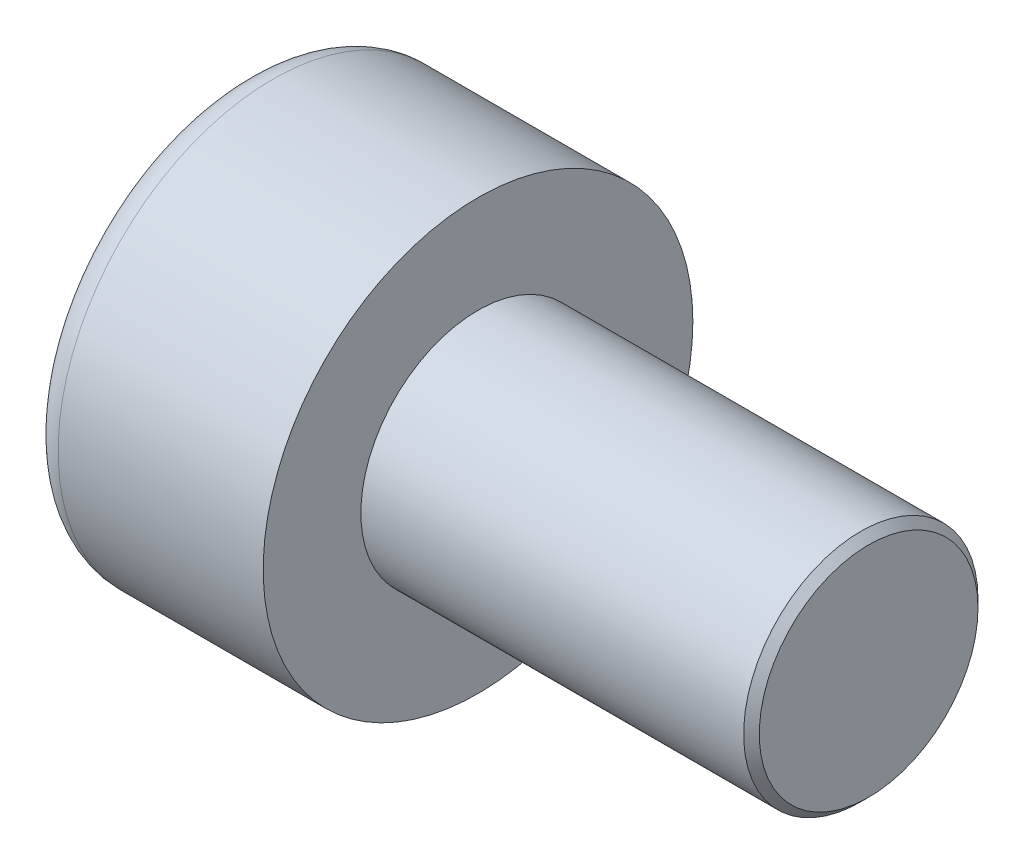
ISO-10303-21;
HEADER;
FILE_DESCRIPTION(('STEP AP214'),'2;1');
FILE_NAME('part.step','',(''),(''),'','','');
FILE_SCHEMA(('AUTOMOTIVE_DESIGN { 1 0 10303 214 1 1 1 1 }'));
ENDSEC;
DATA;
#1=APPLICATION_CONTEXT('core data for automotive mechanical design processes');
#2=APPLICATION_PROTOCOL_DEFINITION('international standard','automotive_design',2000,#1);
#3=PRODUCT_CONTEXT('',#1,'mechanical');
#4=PRODUCT('Part','Part','',(#3));
#5=PRODUCT_RELATED_PRODUCT_CATEGORY('part','',(#4));
#6=PRODUCT_DEFINITION_FORMATION('','',#4);
#7=PRODUCT_DEFINITION_CONTEXT('part definition',#1,'design');
#8=PRODUCT_DEFINITION('design','',#6,#7);
#9=PRODUCT_DEFINITION_SHAPE('','',#8);
#10=(LENGTH_UNIT() NAMED_UNIT(*) SI_UNIT(.MILLI.,.METRE.));
#11=(NAMED_UNIT(*) PLANE_ANGLE_UNIT() SI_UNIT($,.RADIAN.));
#12=(NAMED_UNIT(*) SI_UNIT($,.STERADIAN.) SOLID_ANGLE_UNIT());
#13=UNCERTAINTY_MEASURE_WITH_UNIT(LENGTH_MEASURE(1.E-05),#10,'distance_accuracy_value','');
#14=(GEOMETRIC_REPRESENTATION_CONTEXT(3) GLOBAL_UNCERTAINTY_ASSIGNED_CONTEXT((#13)) GLOBAL_UNIT_ASSIGNED_CONTEXT((#10,
#11,#12)) REPRESENTATION_CONTEXT('',''));
#15=CARTESIAN_POINT('',(0.,0.,0.));
#16=DIRECTION('',(0.,0.,1.));
#17=DIRECTION('',(1.,0.,0.));
#18=AXIS2_PLACEMENT_3D('',#15,#16,#17);
#19=CARTESIAN_POINT('',(1.3,0.,-1.44337567297406));
#20=DIRECTION('',(1.,0.,0.));
#21=DIRECTION('',(0.,0.,-1.));
#22=AXIS2_PLACEMENT_3D('',#19,#20,#21);
#23=PLANE('',#22);
#24=CARTESIAN_POINT('',(1.3,0.,0.));
#25=DIRECTION('',(1.,0.,0.));
#26=DIRECTION('',(0.,0.,-1.));
#27=AXIS2_PLACEMENT_3D('',#24,#25,#26);
#28=CIRCLE('',#27,1.25);
#29=CARTESIAN_POINT('',(1.3,-0.625,-1.08253175473055));
#30=VERTEX_POINT('',#29);
#31=CARTESIAN_POINT('',(1.3,-1.25,0.));
#32=VERTEX_POINT('',#31);
#33=EDGE_CURVE('E163',#30,#32,#28,.F.);
#34=ORIENTED_EDGE('',*,*,#33,.F.);
#35=DIRECTION('',(0.,0.866025403784439,-0.5));
#36=VECTOR('',#35,1.);
#37=CARTESIAN_POINT('',(1.3,-1.25,-0.721687836487032));
#38=LINE('',#37,#36);
#39=CARTESIAN_POINT('',(1.3,-1.25,-0.721687836487032));
#40=VERTEX_POINT('',#39);
#41=EDGE_CURVE('E171',#40,#30,#38,.T.);
#42=ORIENTED_EDGE('',*,*,#41,.F.);
#43=DIRECTION('',(0.,0.,-1.));
#44=VECTOR('',#43,1.);
#45=CARTESIAN_POINT('',(1.3,-1.25,0.721687836487032));
#46=LINE('',#45,#44);
#47=EDGE_CURVE('E188',#32,#40,#46,.T.);
#48=ORIENTED_EDGE('',*,*,#47,.F.);
#49=EDGE_LOOP('',(#34,#42,#48));
#50=FACE_BOUND('',#49,.T.);
#51=ADVANCED_FACE('F39',(#50),#23,.F.);
#52=CARTESIAN_POINT('',(1.3,-0.625,1.08253175473055));
#53=VERTEX_POINT('',#52);
#54=EDGE_CURVE('E294',#32,#53,#28,.F.);
#55=ORIENTED_EDGE('',*,*,#54,.F.);
#56=CARTESIAN_POINT('',(1.3,-1.25,0.721687836487032));
#57=VERTEX_POINT('',#56);
#58=EDGE_CURVE('E189',#57,#32,#46,.T.);
#59=ORIENTED_EDGE('',*,*,#58,.F.);
#60=DIRECTION('',(0.,-0.866025403784439,-0.5));
#61=VECTOR('',#60,1.);
#62=CARTESIAN_POINT('',(1.3,0.,1.44337567297406));
#63=LINE('',#62,#61);
#64=EDGE_CURVE('E184',#53,#57,#63,.T.);
#65=ORIENTED_EDGE('',*,*,#64,.F.);
#66=EDGE_LOOP('',(#55,#59,#65));
#67=FACE_BOUND('',#66,.T.);
#68=ADVANCED_FACE('F129',(#67),#23,.F.);
#69=CARTESIAN_POINT('',(1.3,0.625,1.08253175473055));
#70=VERTEX_POINT('',#69);
#71=EDGE_CURVE('E290',#53,#70,#28,.F.);
#72=ORIENTED_EDGE('',*,*,#71,.F.);
#73=CARTESIAN_POINT('',(1.3,0.,1.44337567297406));
#74=VERTEX_POINT('',#73);
#75=EDGE_CURVE('E185',#74,#53,#63,.T.);
#76=ORIENTED_EDGE('',*,*,#75,.F.);
#77=DIRECTION('',(0.,-0.866025403784439,0.5));
#78=VECTOR('',#77,1.);
#79=CARTESIAN_POINT('',(1.3,1.25,0.721687836487032));
#80=LINE('',#79,#78);
#81=EDGE_CURVE('E180',#70,#74,#80,.T.);
#82=ORIENTED_EDGE('',*,*,#81,.F.);
#83=EDGE_LOOP('',(#72,#76,#82));
#84=FACE_BOUND('',#83,.T.);
#85=ADVANCED_FACE('F135',(#84),#23,.F.);
#86=CARTESIAN_POINT('',(1.3,1.25,0.));
#87=VERTEX_POINT('',#86);
#88=EDGE_CURVE('E160',#70,#87,#28,.F.);
#89=ORIENTED_EDGE('',*,*,#88,.F.);
#90=CARTESIAN_POINT('',(1.3,1.25,0.721687836487032));
#91=VERTEX_POINT('',#90);
#92=EDGE_CURVE('E181',#91,#70,#80,.T.);
#93=ORIENTED_EDGE('',*,*,#92,.F.);
#94=DIRECTION('',(0.,0.,1.));
#95=VECTOR('',#94,1.);
#96=CARTESIAN_POINT('',(1.3,1.25,-0.721687836487032));
#97=LINE('',#96,#95);
#98=EDGE_CURVE('E175',#87,#91,#97,.T.);
#99=ORIENTED_EDGE('',*,*,#98,.F.);
#100=EDGE_LOOP('',(#89,#93,#99));
#101=FACE_BOUND('',#100,.T.);
#102=ADVANCED_FACE('F149',(#101),#23,.F.);
#103=CARTESIAN_POINT('',(1.3,0.,0.));
#104=DIRECTION('',(1.,0.,0.));
#105=DIRECTION('',(0.,0.,-1.));
#106=AXIS2_PLACEMENT_3D('',#103,#104,#105);
#107=CIRCLE('',#106,1.25);
#108=CARTESIAN_POINT('',(1.3,0.625,-1.08253175473055));
#109=VERTEX_POINT('',#108);
#110=EDGE_CURVE('E55',#109,#87,#107,.T.);
#111=ORIENTED_EDGE('',*,*,#110,.T.);
#112=CARTESIAN_POINT('',(1.3,1.25,-0.721687836487032));
#113=VERTEX_POINT('',#112);
#114=EDGE_CURVE('E168',#113,#87,#97,.T.);
#115=ORIENTED_EDGE('',*,*,#114,.F.);
#116=DIRECTION('',(0.,0.866025403784438,0.5));
#117=VECTOR('',#116,1.);
#118=CARTESIAN_POINT('',(1.3,0.,-1.44337567297406));
#119=LINE('',#118,#117);
#120=EDGE_CURVE('E165',#109,#113,#119,.T.);
#121=ORIENTED_EDGE('',*,*,#120,.F.);
#122=EDGE_LOOP('',(#111,#115,#121));
#123=FACE_BOUND('',#122,.T.);
#124=ADVANCED_FACE('F140',(#123),#23,.F.);
#125=EDGE_CURVE('E153',#109,#30,#28,.F.);
#126=ORIENTED_EDGE('',*,*,#125,.F.);
#127=CARTESIAN_POINT('',(1.3,0.,-1.44337567297406));
#128=VERTEX_POINT('',#127);
#129=EDGE_CURVE('E156',#128,#109,#119,.T.);
#130=ORIENTED_EDGE('',*,*,#129,.F.);
#131=EDGE_CURVE('E158',#30,#128,#38,.T.);
#132=ORIENTED_EDGE('',*,*,#131,.F.);
#133=EDGE_LOOP('',(#126,#130,#132));
#134=FACE_BOUND('',#133,.T.);
#135=ADVANCED_FACE('F131',(#134),#23,.F.);
#136=CARTESIAN_POINT('',(0.,0.,0.));
#137=DIRECTION('',(1.,0.,0.));
#138=DIRECTION('',(0.,0.,-1.));
#139=AXIS2_PLACEMENT_3D('',#136,#137,#138);
#140=PLANE('',#139);
#141=CARTESIAN_POINT('',(0.,0.,0.));
#142=DIRECTION('',(1.,0.,0.));
#143=DIRECTION('',(0.,0.,-1.));
#144=AXIS2_PLACEMENT_3D('',#141,#142,#143);
#145=CIRCLE('',#144,2.375);
#146=CARTESIAN_POINT('',(0.,0.,-2.375));
#147=VERTEX_POINT('',#146);
#148=EDGE_CURVE('E228',#147,#147,#145,.F.);
#149=ORIENTED_EDGE('',*,*,#148,.T.);
#150=EDGE_LOOP('',(#149));
#151=FACE_BOUND('',#150,.T.);
#152=DIRECTION('',(0.,0.866025403784439,-0.5));
#153=VECTOR('',#152,1.);
#154=CARTESIAN_POINT('',(0.,-1.25,-0.721687836487032));
#155=LINE('',#154,#153);
#156=CARTESIAN_POINT('',(0.,-1.25,-0.721687836487032));
#157=VERTEX_POINT('',#156);
#158=CARTESIAN_POINT('',(0.,0.,-1.44337567297406));
#159=VERTEX_POINT('',#158);
#160=EDGE_CURVE('E63',#157,#159,#155,.T.);
#161=ORIENTED_EDGE('',*,*,#160,.T.);
#162=DIRECTION('',(0.,0.866025403784438,0.5));
#163=VECTOR('',#162,1.);
#164=CARTESIAN_POINT('',(0.,0.,-1.44337567297406));
#165=LINE('',#164,#163);
#166=CARTESIAN_POINT('',(0.,1.25,-0.721687836487032));
#167=VERTEX_POINT('',#166);
#168=EDGE_CURVE('E194',#159,#167,#165,.T.);
#169=ORIENTED_EDGE('',*,*,#168,.T.);
#170=DIRECTION('',(0.,0.,1.));
#171=VECTOR('',#170,1.);
#172=CARTESIAN_POINT('',(0.,1.25,-0.721687836487032));
#173=LINE('',#172,#171);
#174=CARTESIAN_POINT('',(0.,1.25,0.721687836487032));
#175=VERTEX_POINT('',#174);
#176=EDGE_CURVE('E197',#167,#175,#173,.T.);
#177=ORIENTED_EDGE('',*,*,#176,.T.);
#178=DIRECTION('',(0.,-0.866025403784439,0.5));
#179=VECTOR('',#178,1.);
#180=CARTESIAN_POINT('',(0.,1.25,0.721687836487032));
#181=LINE('',#180,#179);
#182=CARTESIAN_POINT('',(0.,0.,1.44337567297406));
#183=VERTEX_POINT('',#182);
#184=EDGE_CURVE('E200',#175,#183,#181,.T.);
#185=ORIENTED_EDGE('',*,*,#184,.T.);
#186=DIRECTION('',(0.,-0.866025403784439,-0.5));
#187=VECTOR('',#186,1.);
#188=CARTESIAN_POINT('',(0.,0.,1.44337567297406));
#189=LINE('',#188,#187);
#190=CARTESIAN_POINT('',(0.,-1.25,0.721687836487032));
#191=VERTEX_POINT('',#190);
#192=EDGE_CURVE('E203',#183,#191,#189,.T.);
#193=ORIENTED_EDGE('',*,*,#192,.T.);
#194=DIRECTION('',(0.,0.,-1.));
#195=VECTOR('',#194,1.);
#196=CARTESIAN_POINT('',(0.,-1.25,0.721687836487032));
#197=LINE('',#196,#195);
#198=EDGE_CURVE('E206',#191,#157,#197,.T.);
#199=ORIENTED_EDGE('',*,*,#198,.T.);
#200=EDGE_LOOP('',(#161,#169,#177,#185,#193,#199));
#201=FACE_BOUND('',#200,.T.);
#202=ADVANCED_FACE('F139',(#151,#201),#140,.F.);
#203=CARTESIAN_POINT('',(3.,0.,0.));
#204=DIRECTION('',(1.,0.,0.));
#205=DIRECTION('',(0.,0.,-1.));
#206=AXIS2_PLACEMENT_3D('',#203,#204,#205);
#207=PLANE('',#206);
#208=CARTESIAN_POINT('',(3.,0.,0.));
#209=DIRECTION('',(1.,0.,0.));
#210=DIRECTION('',(0.,0.,-1.));
#211=AXIS2_PLACEMENT_3D('',#208,#209,#210);
#212=CIRCLE('',#211,2.75);
#213=CARTESIAN_POINT('',(3.,0.,-2.75));
#214=VERTEX_POINT('',#213);
#215=EDGE_CURVE('E161',#214,#214,#212,.T.);
#216=ORIENTED_EDGE('',*,*,#215,.T.);
#217=EDGE_LOOP('',(#216));
#218=FACE_BOUND('',#217,.T.);
#219=CARTESIAN_POINT('',(3.,0.,0.));
#220=DIRECTION('',(1.,0.,0.));
#221=DIRECTION('',(0.,0.,-1.));
#222=AXIS2_PLACEMENT_3D('',#219,#220,#221);
#223=CIRCLE('',#222,1.5);
#224=CARTESIAN_POINT('',(3.,0.,-1.5));
#225=VERTEX_POINT('',#224);
#226=EDGE_CURVE('E219',#225,#225,#223,.T.);
#227=ORIENTED_EDGE('',*,*,#226,.F.);
#228=EDGE_LOOP('',(#227));
#229=FACE_BOUND('',#228,.T.);
#230=ADVANCED_FACE('F146',(#218,#229),#207,.T.);
#231=CARTESIAN_POINT('',(3.,0.,0.));
#232=DIRECTION('',(-1.,0.,0.));
#233=DIRECTION('',(0.,0.,1.));
#234=AXIS2_PLACEMENT_3D('',#231,#232,#233);
#235=CYLINDRICAL_SURFACE('',#234,2.75);
#236=CARTESIAN_POINT('',(0.375,0.,0.));
#237=DIRECTION('',(1.,0.,0.));
#238=DIRECTION('',(0.,0.,-1.));
#239=AXIS2_PLACEMENT_3D('',#236,#237,#238);
#240=CIRCLE('',#239,2.75);
#241=CARTESIAN_POINT('',(0.375,0.,-2.75));
#242=VERTEX_POINT('',#241);
#243=EDGE_CURVE('E225',#242,#242,#240,.T.);
#244=ORIENTED_EDGE('',*,*,#243,.T.);
#245=EDGE_LOOP('',(#244));
#246=FACE_BOUND('',#245,.T.);
#247=ORIENTED_EDGE('',*,*,#215,.F.);
#248=EDGE_LOOP('',(#247));
#249=FACE_BOUND('',#248,.T.);
#250=ADVANCED_FACE('F245',(#246,#249),#235,.T.);
#251=CARTESIAN_POINT('',(8.,0.,0.));
#252=DIRECTION('',(-1.,0.,0.));
#253=DIRECTION('',(0.,0.,1.));
#254=AXIS2_PLACEMENT_3D('',#251,#252,#253);
#255=CYLINDRICAL_SURFACE('',#254,1.5);
#256=CARTESIAN_POINT('',(7.9,0.,0.));
#257=DIRECTION('',(1.,0.,0.));
#258=DIRECTION('',(0.,0.,-1.));
#259=AXIS2_PLACEMENT_3D('',#256,#257,#258);
#260=CIRCLE('',#259,1.5);
#261=CARTESIAN_POINT('',(7.9,0.,-1.5));
#262=VERTEX_POINT('',#261);
#263=EDGE_CURVE('E11',#262,#262,#260,.F.);
#264=ORIENTED_EDGE('',*,*,#263,.T.);
#265=EDGE_LOOP('',(#264));
#266=FACE_BOUND('',#265,.T.);
#267=ORIENTED_EDGE('',*,*,#226,.T.);
#268=EDGE_LOOP('',(#267));
#269=FACE_BOUND('',#268,.T.);
#270=ADVANCED_FACE('F242',(#266,#269),#255,.T.);
#271=CARTESIAN_POINT('',(8.,0.,0.));
#272=DIRECTION('',(1.,0.,0.));
#273=DIRECTION('',(0.,0.,-1.));
#274=AXIS2_PLACEMENT_3D('',#271,#272,#273);
#275=PLANE('',#274);
#276=CARTESIAN_POINT('',(8.,0.,0.));
#277=DIRECTION('',(1.,0.,0.));
#278=DIRECTION('',(0.,0.,-1.));
#279=AXIS2_PLACEMENT_3D('',#276,#277,#278);
#280=CIRCLE('',#279,1.4);
#281=CARTESIAN_POINT('',(8.,0.,-1.4));
#282=VERTEX_POINT('',#281);
#283=EDGE_CURVE('E48',#282,#282,#280,.T.);
#284=ORIENTED_EDGE('',*,*,#283,.T.);
#285=EDGE_LOOP('',(#284));
#286=FACE_BOUND('',#285,.T.);
#287=ADVANCED_FACE('F234',(#286),#275,.T.);
#288=CARTESIAN_POINT('',(1.3,-1.25,-0.721687836487032));
#289=DIRECTION('',(0.,0.5,0.866025403784439));
#290=DIRECTION('',(0.,-0.866025403784439,0.5));
#291=AXIS2_PLACEMENT_3D('',#288,#289,#290);
#292=PLANE('',#291);
#293=ORIENTED_EDGE('',*,*,#160,.F.);
#294=DIRECTION('',(-1.,0.,0.));
#295=VECTOR('',#294,1.);
#296=CARTESIAN_POINT('',(1.3,-1.25,-0.721687836487032));
#297=LINE('',#296,#295);
#298=EDGE_CURVE('E192',#40,#157,#297,.T.);
#299=ORIENTED_EDGE('',*,*,#298,.F.);
#300=ORIENTED_EDGE('',*,*,#41,.T.);
#301=ORIENTED_EDGE('',*,*,#131,.T.);
#302=DIRECTION('',(-1.,0.,0.));
#303=VECTOR('',#302,1.);
#304=CARTESIAN_POINT('',(1.3,0.,-1.44337567297406));
#305=LINE('',#304,#303);
#306=EDGE_CURVE('E174',#128,#159,#305,.T.);
#307=ORIENTED_EDGE('',*,*,#306,.T.);
#308=EDGE_LOOP('',(#293,#299,#300,#301,#307));
#309=FACE_BOUND('',#308,.T.);
#310=ADVANCED_FACE('F260',(#309),#292,.T.);
#311=CARTESIAN_POINT('',(1.3,0.,-1.44337567297406));
#312=DIRECTION('',(0.,-0.5,0.866025403784438));
#313=DIRECTION('',(0.,-0.866025403784438,-0.5));
#314=AXIS2_PLACEMENT_3D('',#311,#312,#313);
#315=PLANE('',#314);
#316=ORIENTED_EDGE('',*,*,#168,.F.);
#317=ORIENTED_EDGE('',*,*,#306,.F.);
#318=ORIENTED_EDGE('',*,*,#129,.T.);
#319=ORIENTED_EDGE('',*,*,#120,.T.);
#320=DIRECTION('',(-1.,0.,0.));
#321=VECTOR('',#320,1.);
#322=CARTESIAN_POINT('',(1.3,1.25,-0.721687836487032));
#323=LINE('',#322,#321);
#324=EDGE_CURVE('E216',#113,#167,#323,.T.);
#325=ORIENTED_EDGE('',*,*,#324,.T.);
#326=EDGE_LOOP('',(#316,#317,#318,#319,#325));
#327=FACE_BOUND('',#326,.T.);
#328=ADVANCED_FACE('F173',(#327),#315,.T.);
#329=CARTESIAN_POINT('',(1.3,1.25,-0.721687836487032));
#330=DIRECTION('',(0.,-1.,0.));
#331=DIRECTION('',(0.,0.,-1.));
#332=AXIS2_PLACEMENT_3D('',#329,#330,#331);
#333=PLANE('',#332);
#334=ORIENTED_EDGE('',*,*,#176,.F.);
#335=ORIENTED_EDGE('',*,*,#324,.F.);
#336=ORIENTED_EDGE('',*,*,#114,.T.);
#337=ORIENTED_EDGE('',*,*,#98,.T.);
#338=DIRECTION('',(-1.,0.,0.));
#339=VECTOR('',#338,1.);
#340=CARTESIAN_POINT('',(1.3,1.25,0.721687836487032));
#341=LINE('',#340,#339);
#342=EDGE_CURVE('E214',#91,#175,#341,.T.);
#343=ORIENTED_EDGE('',*,*,#342,.T.);
#344=EDGE_LOOP('',(#334,#335,#336,#337,#343));
#345=FACE_BOUND('',#344,.T.);
#346=ADVANCED_FACE('F265',(#345),#333,.T.);
#347=CARTESIAN_POINT('',(1.3,1.25,0.721687836487032));
#348=DIRECTION('',(0.,-0.5,-0.866025403784439));
#349=DIRECTION('',(0.,0.866025403784439,-0.5));
#350=AXIS2_PLACEMENT_3D('',#347,#348,#349);
#351=PLANE('',#350);
#352=ORIENTED_EDGE('',*,*,#184,.F.);
#353=ORIENTED_EDGE('',*,*,#342,.F.);
#354=ORIENTED_EDGE('',*,*,#92,.T.);
#355=ORIENTED_EDGE('',*,*,#81,.T.);
#356=DIRECTION('',(-1.,0.,0.));
#357=VECTOR('',#356,1.);
#358=CARTESIAN_POINT('',(1.3,0.,1.44337567297406));
#359=LINE('',#358,#357);
#360=EDGE_CURVE('E212',#74,#183,#359,.T.);
#361=ORIENTED_EDGE('',*,*,#360,.T.);
#362=EDGE_LOOP('',(#352,#353,#354,#355,#361));
#363=FACE_BOUND('',#362,.T.);
#364=ADVANCED_FACE('F268',(#363),#351,.T.);
#365=CARTESIAN_POINT('',(1.3,0.,1.44337567297406));
#366=DIRECTION('',(0.,0.5,-0.866025403784439));
#367=DIRECTION('',(0.,0.866025403784439,0.5));
#368=AXIS2_PLACEMENT_3D('',#365,#366,#367);
#369=PLANE('',#368);
#370=ORIENTED_EDGE('',*,*,#192,.F.);
#371=ORIENTED_EDGE('',*,*,#360,.F.);
#372=ORIENTED_EDGE('',*,*,#75,.T.);
#373=ORIENTED_EDGE('',*,*,#64,.T.);
#374=DIRECTION('',(-1.,0.,0.));
#375=VECTOR('',#374,1.);
#376=CARTESIAN_POINT('',(1.3,-1.25,0.721687836487032));
#377=LINE('',#376,#375);
#378=EDGE_CURVE('E210',#57,#191,#377,.T.);
#379=ORIENTED_EDGE('',*,*,#378,.T.);
#380=EDGE_LOOP('',(#370,#371,#372,#373,#379));
#381=FACE_BOUND('',#380,.T.);
#382=ADVANCED_FACE('F124',(#381),#369,.T.);
#383=CARTESIAN_POINT('',(1.3,-1.25,0.721687836487032));
#384=DIRECTION('',(0.,1.,0.));
#385=DIRECTION('',(0.,0.,1.));
#386=AXIS2_PLACEMENT_3D('',#383,#384,#385);
#387=PLANE('',#386);
#388=ORIENTED_EDGE('',*,*,#198,.F.);
#389=ORIENTED_EDGE('',*,*,#378,.F.);
#390=ORIENTED_EDGE('',*,*,#58,.T.);
#391=ORIENTED_EDGE('',*,*,#47,.T.);
#392=ORIENTED_EDGE('',*,*,#298,.T.);
#393=EDGE_LOOP('',(#388,#389,#390,#391,#392));
#394=FACE_BOUND('',#393,.T.);
#395=ADVANCED_FACE('F117',(#394),#387,.T.);
#396=CARTESIAN_POINT('',(1.3,0.,0.));
#397=DIRECTION('',(-1.,0.,0.));
#398=DIRECTION('',(0.,0.,1.));
#399=AXIS2_PLACEMENT_3D('',#396,#397,#398);
#400=CONICAL_SURFACE('',#399,1.25,1.04719755119659);
#401=CARTESIAN_POINT('',(2.02168783648704,0.,0.));
#402=VERTEX_POINT('',#401);
#403=VERTEX_LOOP('',#402);
#404=FACE_BOUND('',#403,.T.);
#405=ORIENTED_EDGE('',*,*,#110,.F.);
#406=ORIENTED_EDGE('',*,*,#125,.T.);
#407=ORIENTED_EDGE('',*,*,#33,.T.);
#408=ORIENTED_EDGE('',*,*,#54,.T.);
#409=ORIENTED_EDGE('',*,*,#71,.T.);
#410=ORIENTED_EDGE('',*,*,#88,.T.);
#411=EDGE_LOOP('',(#405,#406,#407,#408,#409,#410));
#412=FACE_BOUND('',#411,.T.);
#413=ADVANCED_FACE('F114',(#404,#412),#400,.F.);
#414=CARTESIAN_POINT('',(0.375,0.,0.));
#415=DIRECTION('',(1.,0.,0.));
#416=DIRECTION('',(0.,0.,-1.));
#417=AXIS2_PLACEMENT_3D('',#414,#415,#416);
#418=TOROIDAL_SURFACE('',#417,2.375,0.375);
#419=ORIENTED_EDGE('',*,*,#148,.F.);
#420=EDGE_LOOP('',(#419));
#421=FACE_BOUND('',#420,.T.);
#422=ORIENTED_EDGE('',*,*,#243,.F.);
#423=EDGE_LOOP('',(#422));
#424=FACE_BOUND('',#423,.T.);
#425=ADVANCED_FACE('F116',(#421,#424),#418,.T.);
#426=CARTESIAN_POINT('',(8.,0.,0.));
#427=DIRECTION('',(-1.,0.,0.));
#428=DIRECTION('',(0.,0.,1.));
#429=AXIS2_PLACEMENT_3D('',#426,#427,#428);
#430=CONICAL_SURFACE('',#429,1.4,0.785398163397451);
#431=ORIENTED_EDGE('',*,*,#263,.F.);
#432=EDGE_LOOP('',(#431));
#433=FACE_BOUND('',#432,.T.);
#434=ORIENTED_EDGE('',*,*,#283,.F.);
#435=EDGE_LOOP('',(#434));
#436=FACE_BOUND('',#435,.T.);
#437=ADVANCED_FACE('F41',(#433,#436),#430,.T.);
#438=CLOSED_SHELL('',(#51,#68,#85,#102,#124,#135,#202,#230,#250,#270,#287,#310,#328,#346,#364,
#382,#395,#413,#425,#437));
#439=MANIFOLD_SOLID_BREP('B2',#438);
#440=ADVANCED_BREP_SHAPE_REPRESENTATION('',(#18,#439),#14);
#441=SHAPE_DEFINITION_REPRESENTATION(#9,#440);
ENDSEC;
END-ISO-10303-21;
